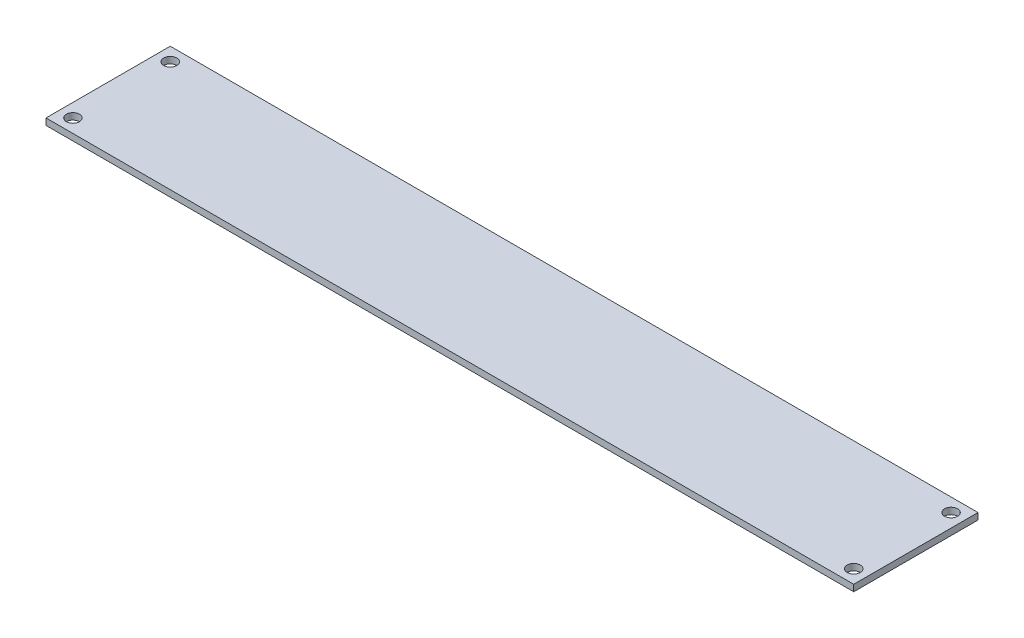
ISO-10303-21;
HEADER;
FILE_DESCRIPTION(('STEP AP214'),'2;1');
FILE_NAME('part.step','',(''),(''),'','','');
FILE_SCHEMA(('AUTOMOTIVE_DESIGN { 1 0 10303 214 1 1 1 1 }'));
ENDSEC;
DATA;
#1=APPLICATION_CONTEXT('core data for automotive mechanical design processes');
#2=APPLICATION_PROTOCOL_DEFINITION('international standard','automotive_design',2000,#1);
#3=PRODUCT_CONTEXT('',#1,'mechanical');
#4=PRODUCT('Part','Part','',(#3));
#5=PRODUCT_RELATED_PRODUCT_CATEGORY('part','',(#4));
#6=PRODUCT_DEFINITION_FORMATION('','',#4);
#7=PRODUCT_DEFINITION_CONTEXT('part definition',#1,'design');
#8=PRODUCT_DEFINITION('design','',#6,#7);
#9=PRODUCT_DEFINITION_SHAPE('','',#8);
#10=(LENGTH_UNIT() NAMED_UNIT(*) SI_UNIT(.MILLI.,.METRE.));
#11=(NAMED_UNIT(*) PLANE_ANGLE_UNIT() SI_UNIT($,.RADIAN.));
#12=(NAMED_UNIT(*) SI_UNIT($,.STERADIAN.) SOLID_ANGLE_UNIT());
#13=UNCERTAINTY_MEASURE_WITH_UNIT(LENGTH_MEASURE(1.E-05),#10,'distance_accuracy_value','');
#14=(GEOMETRIC_REPRESENTATION_CONTEXT(3) GLOBAL_UNCERTAINTY_ASSIGNED_CONTEXT((#13)) GLOBAL_UNIT_ASSIGNED_CONTEXT((#10,
#11,#12)) REPRESENTATION_CONTEXT('',''));
#15=CARTESIAN_POINT('',(0.,0.,0.));
#16=DIRECTION('',(0.,0.,1.));
#17=DIRECTION('',(1.,0.,0.));
#18=AXIS2_PLACEMENT_3D('',#15,#16,#17);
#19=CARTESIAN_POINT('',(0.,1.6,0.));
#20=DIRECTION('',(0.,1.,0.));
#21=DIRECTION('',(0.,0.,1.));
#22=AXIS2_PLACEMENT_3D('',#19,#20,#21);
#23=PLANE('',#22);
#24=CARTESIAN_POINT('',(95.75851843864,1.6,11.93851843864));
#25=DIRECTION('',(0.,1.,0.));
#26=DIRECTION('',(0.,0.,1.));
#27=AXIS2_PLACEMENT_3D('',#24,#25,#26);
#28=CIRCLE('',#27,1.6);
#29=CARTESIAN_POINT('',(95.75851843864,1.6,13.53851843864));
#30=VERTEX_POINT('',#29);
#31=EDGE_CURVE('E121',#30,#30,#28,.T.);
#32=ORIENTED_EDGE('',*,*,#31,.F.);
#33=EDGE_LOOP('',(#32));
#34=FACE_BOUND('',#33,.T.);
#35=CARTESIAN_POINT('',(-95.7585184386401,1.6,-11.93851843864));
#36=DIRECTION('',(0.,1.,0.));
#37=DIRECTION('',(0.,0.,1.));
#38=AXIS2_PLACEMENT_3D('',#35,#36,#37);
#39=CIRCLE('',#38,1.6);
#40=CARTESIAN_POINT('',(-95.7585184386401,1.6,-10.33851843864));
#41=VERTEX_POINT('',#40);
#42=EDGE_CURVE('E100',#41,#41,#39,.T.);
#43=ORIENTED_EDGE('',*,*,#42,.F.);
#44=EDGE_LOOP('',(#43));
#45=FACE_BOUND('',#44,.T.);
#46=DIRECTION('',(0.,0.,-1.));
#47=VECTOR('',#46,1.);
#48=CARTESIAN_POINT('',(99.06,1.6,-15.24));
#49=LINE('',#48,#47);
#50=CARTESIAN_POINT('',(99.06,1.6,15.24));
#51=VERTEX_POINT('',#50);
#52=CARTESIAN_POINT('',(99.06,1.6,-15.24));
#53=VERTEX_POINT('',#52);
#54=EDGE_CURVE('E85',#51,#53,#49,.T.);
#55=ORIENTED_EDGE('',*,*,#54,.T.);
#56=DIRECTION('',(-1.,0.,0.));
#57=VECTOR('',#56,1.);
#58=CARTESIAN_POINT('',(-99.0600000000001,1.6,-15.24));
#59=LINE('',#58,#57);
#60=CARTESIAN_POINT('',(-99.0600000000001,1.6,-15.24));
#61=VERTEX_POINT('',#60);
#62=EDGE_CURVE('E80',#53,#61,#59,.T.);
#63=ORIENTED_EDGE('',*,*,#62,.T.);
#64=DIRECTION('',(0.,0.,1.));
#65=VECTOR('',#64,1.);
#66=CARTESIAN_POINT('',(-99.0600000000001,1.6,-15.24));
#67=LINE('',#66,#65);
#68=CARTESIAN_POINT('',(-99.0600000000001,1.6,15.24));
#69=VERTEX_POINT('',#68);
#70=EDGE_CURVE('E83',#61,#69,#67,.T.);
#71=ORIENTED_EDGE('',*,*,#70,.T.);
#72=DIRECTION('',(1.,0.,0.));
#73=VECTOR('',#72,1.);
#74=CARTESIAN_POINT('',(-99.0600000000001,1.6,15.24));
#75=LINE('',#74,#73);
#76=EDGE_CURVE('E50',#69,#51,#75,.T.);
#77=ORIENTED_EDGE('',*,*,#76,.T.);
#78=EDGE_LOOP('',(#55,#63,#71,#77));
#79=FACE_BOUND('',#78,.T.);
#80=CARTESIAN_POINT('',(-95.7585184386401,1.6,11.93851843864));
#81=DIRECTION('',(0.,1.,0.));
#82=DIRECTION('',(0.,0.,-1.));
#83=AXIS2_PLACEMENT_3D('',#80,#81,#82);
#84=CIRCLE('',#83,1.6);
#85=CARTESIAN_POINT('',(-95.7585184386401,1.6,10.33851843864));
#86=VERTEX_POINT('',#85);
#87=EDGE_CURVE('E115',#86,#86,#84,.T.);
#88=ORIENTED_EDGE('',*,*,#87,.F.);
#89=EDGE_LOOP('',(#88));
#90=FACE_BOUND('',#89,.T.);
#91=CARTESIAN_POINT('',(95.75851843864,1.6,-11.93851843864));
#92=DIRECTION('',(0.,1.,0.));
#93=DIRECTION('',(0.,0.,-1.));
#94=AXIS2_PLACEMENT_3D('',#91,#92,#93);
#95=CIRCLE('',#94,1.6);
#96=CARTESIAN_POINT('',(95.75851843864,1.6,-13.53851843864));
#97=VERTEX_POINT('',#96);
#98=EDGE_CURVE('E127',#97,#97,#95,.T.);
#99=ORIENTED_EDGE('',*,*,#98,.F.);
#100=EDGE_LOOP('',(#99));
#101=FACE_BOUND('',#100,.T.);
#102=ADVANCED_FACE('F33',(#34,#45,#79,#90,#101),#23,.T.);
#103=CARTESIAN_POINT('',(0.,0.,0.));
#104=DIRECTION('',(0.,1.,0.));
#105=DIRECTION('',(0.,0.,1.));
#106=AXIS2_PLACEMENT_3D('',#103,#104,#105);
#107=PLANE('',#106);
#108=DIRECTION('',(0.,0.,-1.));
#109=VECTOR('',#108,1.);
#110=CARTESIAN_POINT('',(99.06,0.,-15.24));
#111=LINE('',#110,#109);
#112=CARTESIAN_POINT('',(99.06,0.,15.24));
#113=VERTEX_POINT('',#112);
#114=CARTESIAN_POINT('',(99.06,0.,-15.24));
#115=VERTEX_POINT('',#114);
#116=EDGE_CURVE('E97',#113,#115,#111,.T.);
#117=ORIENTED_EDGE('',*,*,#116,.F.);
#118=DIRECTION('',(1.,0.,0.));
#119=VECTOR('',#118,1.);
#120=CARTESIAN_POINT('',(-99.0600000000001,0.,15.24));
#121=LINE('',#120,#119);
#122=CARTESIAN_POINT('',(-99.0600000000001,0.,15.24));
#123=VERTEX_POINT('',#122);
#124=EDGE_CURVE('E73',#123,#113,#121,.T.);
#125=ORIENTED_EDGE('',*,*,#124,.F.);
#126=DIRECTION('',(0.,0.,1.));
#127=VECTOR('',#126,1.);
#128=CARTESIAN_POINT('',(-99.0600000000001,0.,-15.24));
#129=LINE('',#128,#127);
#130=CARTESIAN_POINT('',(-99.0600000000001,0.,-15.24));
#131=VERTEX_POINT('',#130);
#132=EDGE_CURVE('E67',#131,#123,#129,.T.);
#133=ORIENTED_EDGE('',*,*,#132,.F.);
#134=DIRECTION('',(-1.,0.,0.));
#135=VECTOR('',#134,1.);
#136=CARTESIAN_POINT('',(-99.0600000000001,0.,-15.24));
#137=LINE('',#136,#135);
#138=EDGE_CURVE('E89',#115,#131,#137,.T.);
#139=ORIENTED_EDGE('',*,*,#138,.F.);
#140=EDGE_LOOP('',(#117,#125,#133,#139));
#141=FACE_BOUND('',#140,.T.);
#142=CARTESIAN_POINT('',(-95.7585184386401,0.,-11.93851843864));
#143=DIRECTION('',(0.,1.,0.));
#144=DIRECTION('',(0.,0.,1.));
#145=AXIS2_PLACEMENT_3D('',#142,#143,#144);
#146=CIRCLE('',#145,1.6);
#147=CARTESIAN_POINT('',(-95.7585184386401,0.,-10.33851843864));
#148=VERTEX_POINT('',#147);
#149=EDGE_CURVE('E112',#148,#148,#146,.T.);
#150=ORIENTED_EDGE('',*,*,#149,.T.);
#151=EDGE_LOOP('',(#150));
#152=FACE_BOUND('',#151,.T.);
#153=CARTESIAN_POINT('',(-95.7585184386401,0.,11.93851843864));
#154=DIRECTION('',(0.,1.,0.));
#155=DIRECTION('',(0.,0.,-1.));
#156=AXIS2_PLACEMENT_3D('',#153,#154,#155);
#157=CIRCLE('',#156,1.6);
#158=CARTESIAN_POINT('',(-95.7585184386401,0.,10.33851843864));
#159=VERTEX_POINT('',#158);
#160=EDGE_CURVE('E118',#159,#159,#157,.T.);
#161=ORIENTED_EDGE('',*,*,#160,.T.);
#162=EDGE_LOOP('',(#161));
#163=FACE_BOUND('',#162,.T.);
#164=CARTESIAN_POINT('',(95.75851843864,0.,11.93851843864));
#165=DIRECTION('',(0.,1.,0.));
#166=DIRECTION('',(0.,0.,1.));
#167=AXIS2_PLACEMENT_3D('',#164,#165,#166);
#168=CIRCLE('',#167,1.6);
#169=CARTESIAN_POINT('',(95.75851843864,0.,13.53851843864));
#170=VERTEX_POINT('',#169);
#171=EDGE_CURVE('E124',#170,#170,#168,.T.);
#172=ORIENTED_EDGE('',*,*,#171,.T.);
#173=EDGE_LOOP('',(#172));
#174=FACE_BOUND('',#173,.T.);
#175=CARTESIAN_POINT('',(95.75851843864,0.,-11.93851843864));
#176=DIRECTION('',(0.,1.,0.));
#177=DIRECTION('',(0.,0.,-1.));
#178=AXIS2_PLACEMENT_3D('',#175,#176,#177);
#179=CIRCLE('',#178,1.6);
#180=CARTESIAN_POINT('',(95.75851843864,0.,-13.53851843864));
#181=VERTEX_POINT('',#180);
#182=EDGE_CURVE('E130',#181,#181,#179,.T.);
#183=ORIENTED_EDGE('',*,*,#182,.T.);
#184=EDGE_LOOP('',(#183));
#185=FACE_BOUND('',#184,.T.);
#186=ADVANCED_FACE('F108',(#141,#152,#163,#174,#185),#107,.F.);
#187=CARTESIAN_POINT('',(99.06,1.6,-15.24));
#188=DIRECTION('',(-1.,0.,0.));
#189=DIRECTION('',(0.,0.,1.));
#190=AXIS2_PLACEMENT_3D('',#187,#188,#189);
#191=PLANE('',#190);
#192=ORIENTED_EDGE('',*,*,#116,.T.);
#193=DIRECTION('',(0.,-1.,0.));
#194=VECTOR('',#193,1.);
#195=CARTESIAN_POINT('',(99.06,1.6,-15.24));
#196=LINE('',#195,#194);
#197=EDGE_CURVE('E11',#53,#115,#196,.T.);
#198=ORIENTED_EDGE('',*,*,#197,.F.);
#199=ORIENTED_EDGE('',*,*,#54,.F.);
#200=DIRECTION('',(0.,-1.,0.));
#201=VECTOR('',#200,1.);
#202=CARTESIAN_POINT('',(99.06,1.6,15.24));
#203=LINE('',#202,#201);
#204=EDGE_CURVE('E93',#51,#113,#203,.T.);
#205=ORIENTED_EDGE('',*,*,#204,.T.);
#206=EDGE_LOOP('',(#192,#198,#199,#205));
#207=FACE_BOUND('',#206,.T.);
#208=ADVANCED_FACE('F35',(#207),#191,.F.);
#209=CARTESIAN_POINT('',(-99.0600000000001,1.6,-15.24));
#210=DIRECTION('',(0.,0.,1.));
#211=DIRECTION('',(1.,0.,0.));
#212=AXIS2_PLACEMENT_3D('',#209,#210,#211);
#213=PLANE('',#212);
#214=ORIENTED_EDGE('',*,*,#138,.T.);
#215=DIRECTION('',(0.,-1.,0.));
#216=VECTOR('',#215,1.);
#217=CARTESIAN_POINT('',(-99.0600000000001,1.6,-15.24));
#218=LINE('',#217,#216);
#219=EDGE_CURVE('E42',#61,#131,#218,.T.);
#220=ORIENTED_EDGE('',*,*,#219,.F.);
#221=ORIENTED_EDGE('',*,*,#62,.F.);
#222=ORIENTED_EDGE('',*,*,#197,.T.);
#223=EDGE_LOOP('',(#214,#220,#221,#222));
#224=FACE_BOUND('',#223,.T.);
#225=ADVANCED_FACE('F88',(#224),#213,.F.);
#226=CARTESIAN_POINT('',(-99.0600000000001,1.6,-15.24));
#227=DIRECTION('',(1.,0.,0.));
#228=DIRECTION('',(0.,0.,-1.));
#229=AXIS2_PLACEMENT_3D('',#226,#227,#228);
#230=PLANE('',#229);
#231=ORIENTED_EDGE('',*,*,#132,.T.);
#232=DIRECTION('',(0.,-1.,0.));
#233=VECTOR('',#232,1.);
#234=CARTESIAN_POINT('',(-99.0600000000001,1.6,15.24));
#235=LINE('',#234,#233);
#236=EDGE_CURVE('E90',#69,#123,#235,.T.);
#237=ORIENTED_EDGE('',*,*,#236,.F.);
#238=ORIENTED_EDGE('',*,*,#70,.F.);
#239=ORIENTED_EDGE('',*,*,#219,.T.);
#240=EDGE_LOOP('',(#231,#237,#238,#239));
#241=FACE_BOUND('',#240,.T.);
#242=ADVANCED_FACE('F91',(#241),#230,.F.);
#243=CARTESIAN_POINT('',(-99.0600000000001,1.6,15.24));
#244=DIRECTION('',(0.,0.,-1.));
#245=DIRECTION('',(-1.,0.,0.));
#246=AXIS2_PLACEMENT_3D('',#243,#244,#245);
#247=PLANE('',#246);
#248=ORIENTED_EDGE('',*,*,#124,.T.);
#249=ORIENTED_EDGE('',*,*,#204,.F.);
#250=ORIENTED_EDGE('',*,*,#76,.F.);
#251=ORIENTED_EDGE('',*,*,#236,.T.);
#252=EDGE_LOOP('',(#248,#249,#250,#251));
#253=FACE_BOUND('',#252,.T.);
#254=ADVANCED_FACE('F105',(#253),#247,.F.);
#255=CARTESIAN_POINT('',(-95.7585184386401,1.6,-11.93851843864));
#256=DIRECTION('',(0.,-1.,0.));
#257=DIRECTION('',(0.,0.,-1.));
#258=AXIS2_PLACEMENT_3D('',#255,#256,#257);
#259=CYLINDRICAL_SURFACE('',#258,1.6);
#260=ORIENTED_EDGE('',*,*,#42,.T.);
#261=EDGE_LOOP('',(#260));
#262=FACE_BOUND('',#261,.T.);
#263=ORIENTED_EDGE('',*,*,#149,.F.);
#264=EDGE_LOOP('',(#263));
#265=FACE_BOUND('',#264,.T.);
#266=ADVANCED_FACE('F149',(#262,#265),#259,.F.);
#267=CARTESIAN_POINT('',(-95.7585184386401,1.6,11.93851843864));
#268=DIRECTION('',(0.,-1.,0.));
#269=DIRECTION('',(0.,0.,-1.));
#270=AXIS2_PLACEMENT_3D('',#267,#268,#269);
#271=CYLINDRICAL_SURFACE('',#270,1.6);
#272=ORIENTED_EDGE('',*,*,#87,.T.);
#273=EDGE_LOOP('',(#272));
#274=FACE_BOUND('',#273,.T.);
#275=ORIENTED_EDGE('',*,*,#160,.F.);
#276=EDGE_LOOP('',(#275));
#277=FACE_BOUND('',#276,.T.);
#278=ADVANCED_FACE('F195',(#274,#277),#271,.F.);
#279=CARTESIAN_POINT('',(95.75851843864,1.6,11.93851843864));
#280=DIRECTION('',(0.,-1.,0.));
#281=DIRECTION('',(0.,0.,-1.));
#282=AXIS2_PLACEMENT_3D('',#279,#280,#281);
#283=CYLINDRICAL_SURFACE('',#282,1.6);
#284=ORIENTED_EDGE('',*,*,#31,.T.);
#285=EDGE_LOOP('',(#284));
#286=FACE_BOUND('',#285,.T.);
#287=ORIENTED_EDGE('',*,*,#171,.F.);
#288=EDGE_LOOP('',(#287));
#289=FACE_BOUND('',#288,.T.);
#290=ADVANCED_FACE('F203',(#286,#289),#283,.F.);
#291=CARTESIAN_POINT('',(95.75851843864,1.6,-11.93851843864));
#292=DIRECTION('',(0.,-1.,0.));
#293=DIRECTION('',(0.,0.,-1.));
#294=AXIS2_PLACEMENT_3D('',#291,#292,#293);
#295=CYLINDRICAL_SURFACE('',#294,1.6);
#296=ORIENTED_EDGE('',*,*,#98,.T.);
#297=EDGE_LOOP('',(#296));
#298=FACE_BOUND('',#297,.T.);
#299=ORIENTED_EDGE('',*,*,#182,.F.);
#300=EDGE_LOOP('',(#299));
#301=FACE_BOUND('',#300,.T.);
#302=ADVANCED_FACE('F136',(#298,#301),#295,.F.);
#303=CLOSED_SHELL('',(#102,#186,#208,#225,#242,#254,#266,#278,#290,#302));
#304=MANIFOLD_SOLID_BREP('B2',#303);
#305=ADVANCED_BREP_SHAPE_REPRESENTATION('',(#18,#304),#14);
#306=SHAPE_DEFINITION_REPRESENTATION(#9,#305);
ENDSEC;
END-ISO-10303-21;
